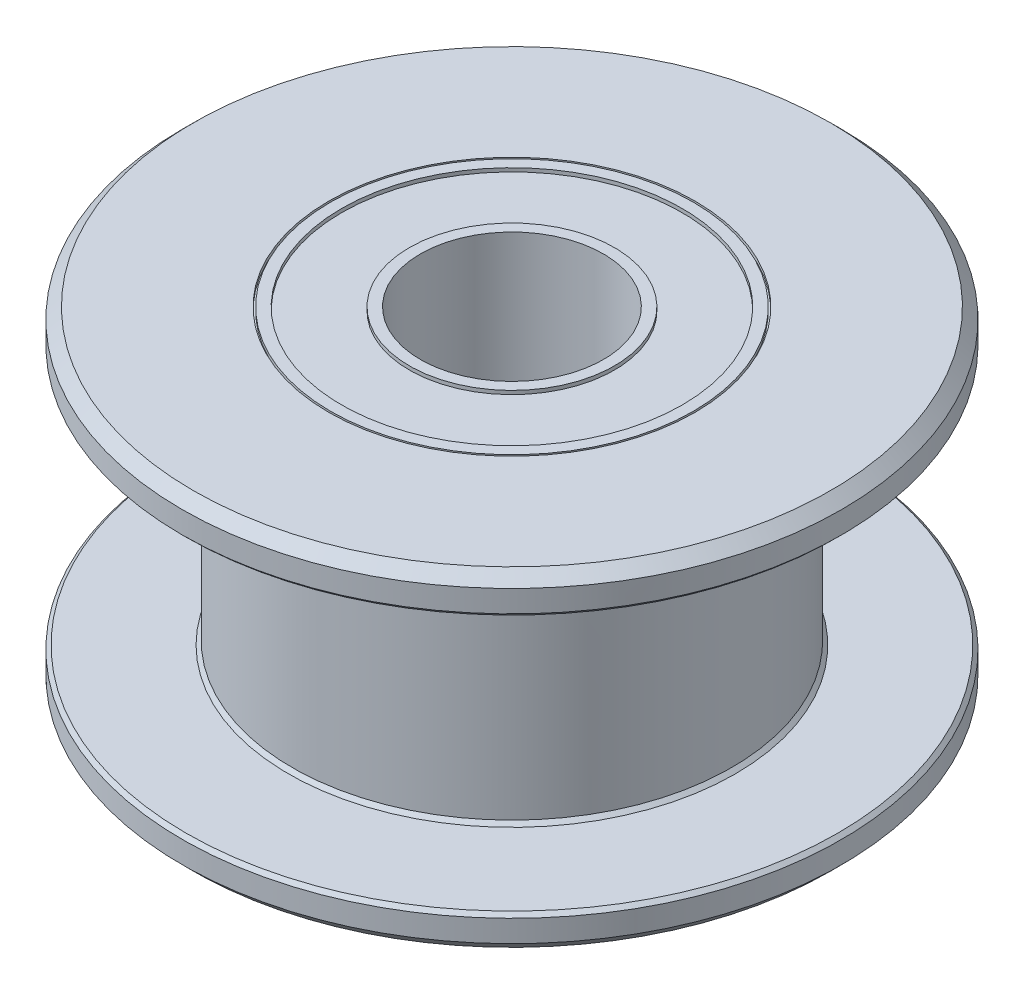
ISO-10303-21;
HEADER;
FILE_DESCRIPTION(('STEP AP214'),'2;1');
FILE_NAME('part.step','',(''),(''),'','','');
FILE_SCHEMA(('AUTOMOTIVE_DESIGN { 1 0 10303 214 1 1 1 1 }'));
ENDSEC;
DATA;
#1=APPLICATION_CONTEXT('core data for automotive mechanical design processes');
#2=APPLICATION_PROTOCOL_DEFINITION('international standard','automotive_design',2000,#1);
#3=PRODUCT_CONTEXT('',#1,'mechanical');
#4=PRODUCT('Part','Part','',(#3));
#5=PRODUCT_RELATED_PRODUCT_CATEGORY('part','',(#4));
#6=PRODUCT_DEFINITION_FORMATION('','',#4);
#7=PRODUCT_DEFINITION_CONTEXT('part definition',#1,'design');
#8=PRODUCT_DEFINITION('design','',#6,#7);
#9=PRODUCT_DEFINITION_SHAPE('','',#8);
#10=(LENGTH_UNIT() NAMED_UNIT(*) SI_UNIT(.MILLI.,.METRE.));
#11=(NAMED_UNIT(*) PLANE_ANGLE_UNIT() SI_UNIT($,.RADIAN.));
#12=(NAMED_UNIT(*) SI_UNIT($,.STERADIAN.) SOLID_ANGLE_UNIT());
#13=UNCERTAINTY_MEASURE_WITH_UNIT(LENGTH_MEASURE(1.E-05),#10,'distance_accuracy_value','');
#14=(GEOMETRIC_REPRESENTATION_CONTEXT(3) GLOBAL_UNCERTAINTY_ASSIGNED_CONTEXT((#13)) GLOBAL_UNIT_ASSIGNED_CONTEXT((#10,
#11,#12)) REPRESENTATION_CONTEXT('',''));
#15=CARTESIAN_POINT('',(0.,0.,0.));
#16=DIRECTION('',(0.,0.,1.));
#17=DIRECTION('',(1.,0.,0.));
#18=AXIS2_PLACEMENT_3D('',#15,#16,#17);
#19=CARTESIAN_POINT('',(-2.5,4.5,0.));
#20=DIRECTION('',(0.,1.,0.));
#21=DIRECTION('',(-1.,0.,0.));
#22=AXIS2_PLACEMENT_3D('',#19,#20,#21);
#23=CYLINDRICAL_SURFACE('',#22,2.8);
#24=CARTESIAN_POINT('',(-2.5,4.5,0.));
#25=DIRECTION('',(0.,1.,0.));
#26=DIRECTION('',(-1.,0.,0.));
#27=AXIS2_PLACEMENT_3D('',#24,#25,#26);
#28=CIRCLE('',#27,2.8);
#29=CARTESIAN_POINT('',(-5.3,4.5,0.));
#30=VERTEX_POINT('',#29);
#31=EDGE_CURVE('E137',#30,#30,#28,.T.);
#32=ORIENTED_EDGE('',*,*,#31,.F.);
#33=EDGE_LOOP('',(#32));
#34=FACE_BOUND('',#33,.T.);
#35=CARTESIAN_POINT('',(-2.5,4.4,0.));
#36=DIRECTION('',(0.,1.,0.));
#37=DIRECTION('',(-1.,0.,0.));
#38=AXIS2_PLACEMENT_3D('',#35,#36,#37);
#39=CIRCLE('',#38,2.8);
#40=CARTESIAN_POINT('',(-5.3,4.4,0.));
#41=VERTEX_POINT('',#40);
#42=EDGE_CURVE('E89',#41,#41,#39,.T.);
#43=ORIENTED_EDGE('',*,*,#42,.T.);
#44=EDGE_LOOP('',(#43));
#45=FACE_BOUND('',#44,.T.);
#46=ADVANCED_FACE('F38',(#34,#45),#23,.T.);
#47=CARTESIAN_POINT('',(2.15,4.4,0.));
#48=DIRECTION('',(0.,-1.,0.));
#49=DIRECTION('',(1.,0.,0.));
#50=AXIS2_PLACEMENT_3D('',#47,#48,#49);
#51=PLANE('',#50);
#52=ORIENTED_EDGE('',*,*,#42,.F.);
#53=EDGE_LOOP('',(#52));
#54=FACE_BOUND('',#53,.T.);
#55=CARTESIAN_POINT('',(-2.5,4.4,0.));
#56=DIRECTION('',(0.,1.,0.));
#57=DIRECTION('',(-1.,0.,0.));
#58=AXIS2_PLACEMENT_3D('',#55,#56,#57);
#59=CIRCLE('',#58,4.65);
#60=CARTESIAN_POINT('',(-7.15,4.4,0.));
#61=VERTEX_POINT('',#60);
#62=EDGE_CURVE('E93',#61,#61,#59,.T.);
#63=ORIENTED_EDGE('',*,*,#62,.T.);
#64=EDGE_LOOP('',(#63));
#65=FACE_BOUND('',#64,.T.);
#66=ADVANCED_FACE('F147',(#54,#65),#51,.F.);
#67=CARTESIAN_POINT('',(-2.5,4.5,0.));
#68=DIRECTION('',(0.,1.,0.));
#69=DIRECTION('',(-1.,0.,0.));
#70=AXIS2_PLACEMENT_3D('',#67,#68,#69);
#71=CYLINDRICAL_SURFACE('',#70,4.65);
#72=ORIENTED_EDGE('',*,*,#62,.F.);
#73=EDGE_LOOP('',(#72));
#74=FACE_BOUND('',#73,.T.);
#75=CARTESIAN_POINT('',(-2.5,4.5,0.));
#76=DIRECTION('',(0.,1.,0.));
#77=DIRECTION('',(-1.,0.,0.));
#78=AXIS2_PLACEMENT_3D('',#75,#76,#77);
#79=CIRCLE('',#78,4.65);
#80=CARTESIAN_POINT('',(-7.15,4.5,0.));
#81=VERTEX_POINT('',#80);
#82=EDGE_CURVE('E97',#81,#81,#79,.T.);
#83=ORIENTED_EDGE('',*,*,#82,.T.);
#84=EDGE_LOOP('',(#83));
#85=FACE_BOUND('',#84,.T.);
#86=ADVANCED_FACE('F153',(#74,#85),#71,.F.);
#87=CARTESIAN_POINT('',(2.45,4.5,0.));
#88=DIRECTION('',(0.,-1.,0.));
#89=DIRECTION('',(1.,0.,0.));
#90=AXIS2_PLACEMENT_3D('',#87,#88,#89);
#91=PLANE('',#90);
#92=ORIENTED_EDGE('',*,*,#82,.F.);
#93=EDGE_LOOP('',(#92));
#94=FACE_BOUND('',#93,.T.);
#95=CARTESIAN_POINT('',(-2.5,4.5,0.));
#96=DIRECTION('',(0.,1.,0.));
#97=DIRECTION('',(-1.,0.,0.));
#98=AXIS2_PLACEMENT_3D('',#95,#96,#97);
#99=CIRCLE('',#98,4.95);
#100=CARTESIAN_POINT('',(-7.45,4.5,0.));
#101=VERTEX_POINT('',#100);
#102=EDGE_CURVE('E101',#101,#101,#99,.T.);
#103=ORIENTED_EDGE('',*,*,#102,.T.);
#104=EDGE_LOOP('',(#103));
#105=FACE_BOUND('',#104,.T.);
#106=ADVANCED_FACE('F159',(#94,#105),#91,.F.);
#107=CARTESIAN_POINT('',(-2.5,4.5,0.));
#108=DIRECTION('',(0.,1.,0.));
#109=DIRECTION('',(-1.,0.,0.));
#110=AXIS2_PLACEMENT_3D('',#107,#108,#109);
#111=CYLINDRICAL_SURFACE('',#110,4.95);
#112=ORIENTED_EDGE('',*,*,#102,.F.);
#113=EDGE_LOOP('',(#112));
#114=FACE_BOUND('',#113,.T.);
#115=CARTESIAN_POINT('',(-2.5,4.4,0.));
#116=DIRECTION('',(0.,1.,0.));
#117=DIRECTION('',(-1.,0.,0.));
#118=AXIS2_PLACEMENT_3D('',#115,#116,#117);
#119=CIRCLE('',#118,4.95);
#120=CARTESIAN_POINT('',(-7.45,4.4,0.));
#121=VERTEX_POINT('',#120);
#122=EDGE_CURVE('E105',#121,#121,#119,.T.);
#123=ORIENTED_EDGE('',*,*,#122,.T.);
#124=EDGE_LOOP('',(#123));
#125=FACE_BOUND('',#124,.T.);
#126=ADVANCED_FACE('F165',(#114,#125),#111,.T.);
#127=CARTESIAN_POINT('',(2.5,4.4,0.));
#128=DIRECTION('',(0.,-1.,0.));
#129=DIRECTION('',(1.,0.,0.));
#130=AXIS2_PLACEMENT_3D('',#127,#128,#129);
#131=PLANE('',#130);
#132=ORIENTED_EDGE('',*,*,#122,.F.);
#133=EDGE_LOOP('',(#132));
#134=FACE_BOUND('',#133,.T.);
#135=CARTESIAN_POINT('',(-2.5,4.4,0.));
#136=DIRECTION('',(0.,1.,0.));
#137=DIRECTION('',(-1.,0.,0.));
#138=AXIS2_PLACEMENT_3D('',#135,#136,#137);
#139=CIRCLE('',#138,5.);
#140=CARTESIAN_POINT('',(-7.5,4.4,0.));
#141=VERTEX_POINT('',#140);
#142=EDGE_CURVE('E109',#141,#141,#139,.T.);
#143=ORIENTED_EDGE('',*,*,#142,.T.);
#144=EDGE_LOOP('',(#143));
#145=FACE_BOUND('',#144,.T.);
#146=ADVANCED_FACE('F171',(#134,#145),#131,.F.);
#147=CARTESIAN_POINT('',(-2.5,4.5,0.));
#148=DIRECTION('',(0.,1.,0.));
#149=DIRECTION('',(-1.,0.,0.));
#150=AXIS2_PLACEMENT_3D('',#147,#148,#149);
#151=CYLINDRICAL_SURFACE('',#150,5.);
#152=ORIENTED_EDGE('',*,*,#142,.F.);
#153=EDGE_LOOP('',(#152));
#154=FACE_BOUND('',#153,.T.);
#155=CARTESIAN_POINT('',(-2.5,4.5,0.));
#156=DIRECTION('',(0.,1.,0.));
#157=DIRECTION('',(-1.,0.,0.));
#158=AXIS2_PLACEMENT_3D('',#155,#156,#157);
#159=CIRCLE('',#158,5.);
#160=CARTESIAN_POINT('',(-7.5,4.5,0.));
#161=VERTEX_POINT('',#160);
#162=EDGE_CURVE('E113',#161,#161,#159,.T.);
#163=ORIENTED_EDGE('',*,*,#162,.T.);
#164=EDGE_LOOP('',(#163));
#165=FACE_BOUND('',#164,.T.);
#166=ADVANCED_FACE('F177',(#154,#165),#151,.F.);
#167=CARTESIAN_POINT('',(6.5,4.5,0.));
#168=DIRECTION('',(0.,-1.,0.));
#169=DIRECTION('',(1.,0.,0.));
#170=AXIS2_PLACEMENT_3D('',#167,#168,#169);
#171=PLANE('',#170);
#172=CARTESIAN_POINT('',(-2.5,4.5,0.));
#173=DIRECTION('',(0.,-1.,0.));
#174=DIRECTION('',(1.,0.,0.));
#175=AXIS2_PLACEMENT_3D('',#172,#173,#174);
#176=CIRCLE('',#175,8.7);
#177=CARTESIAN_POINT('',(-2.5,4.5,-8.7));
#178=VERTEX_POINT('',#177);
#179=EDGE_CURVE('E77',#178,#178,#176,.F.);
#180=ORIENTED_EDGE('',*,*,#179,.T.);
#181=EDGE_LOOP('',(#180));
#182=FACE_BOUND('',#181,.T.);
#183=ORIENTED_EDGE('',*,*,#162,.F.);
#184=EDGE_LOOP('',(#183));
#185=FACE_BOUND('',#184,.T.);
#186=ADVANCED_FACE('F183',(#182,#185),#171,.F.);
#187=CARTESIAN_POINT('',(-2.5,4.5,0.));
#188=DIRECTION('',(0.,1.,0.));
#189=DIRECTION('',(-1.,0.,0.));
#190=AXIS2_PLACEMENT_3D('',#187,#188,#189);
#191=CYLINDRICAL_SURFACE('',#190,9.);
#192=CARTESIAN_POINT('',(-2.5,3.6,0.));
#193=DIRECTION('',(0.,1.,0.));
#194=DIRECTION('',(0.,0.,1.));
#195=AXIS2_PLACEMENT_3D('',#192,#193,#194);
#196=CIRCLE('',#195,9.);
#197=CARTESIAN_POINT('',(-2.5,3.6,9.));
#198=VERTEX_POINT('',#197);
#199=EDGE_CURVE('E46',#198,#198,#196,.T.);
#200=ORIENTED_EDGE('',*,*,#199,.T.);
#201=EDGE_LOOP('',(#200));
#202=FACE_BOUND('',#201,.T.);
#203=CARTESIAN_POINT('',(-2.5,4.19999999999999,0.));
#204=DIRECTION('',(0.,-1.,0.));
#205=DIRECTION('',(0.,0.,-1.));
#206=AXIS2_PLACEMENT_3D('',#203,#204,#205);
#207=CIRCLE('',#206,9.);
#208=CARTESIAN_POINT('',(-2.5,4.19999999999999,-9.));
#209=VERTEX_POINT('',#208);
#210=EDGE_CURVE('E73',#209,#209,#207,.T.);
#211=ORIENTED_EDGE('',*,*,#210,.T.);
#212=EDGE_LOOP('',(#211));
#213=FACE_BOUND('',#212,.T.);
#214=ADVANCED_FACE('F188',(#202,#213),#191,.T.);
#215=CARTESIAN_POINT('',(6.5,3.5,0.));
#216=DIRECTION('',(0.,1.,0.));
#217=DIRECTION('',(-1.,0.,0.));
#218=AXIS2_PLACEMENT_3D('',#215,#216,#217);
#219=PLANE('',#218);
#220=CARTESIAN_POINT('',(-2.5,3.5,0.));
#221=DIRECTION('',(0.,1.,0.));
#222=DIRECTION('',(-1.,0.,0.));
#223=AXIS2_PLACEMENT_3D('',#220,#221,#222);
#224=CIRCLE('',#223,8.9);
#225=CARTESIAN_POINT('',(-11.4,3.49999999999999,0.));
#226=VERTEX_POINT('',#225);
#227=EDGE_CURVE('E10',#226,#226,#224,.F.);
#228=ORIENTED_EDGE('',*,*,#227,.T.);
#229=EDGE_LOOP('',(#228));
#230=FACE_BOUND('',#229,.T.);
#231=CARTESIAN_POINT('',(-2.5,3.5,0.));
#232=DIRECTION('',(0.,1.,0.));
#233=DIRECTION('',(-1.,0.,0.));
#234=AXIS2_PLACEMENT_3D('',#231,#232,#233);
#235=CIRCLE('',#234,6.);
#236=CARTESIAN_POINT('',(-8.5,3.5,0.));
#237=VERTEX_POINT('',#236);
#238=EDGE_CURVE('E117',#237,#237,#235,.T.);
#239=ORIENTED_EDGE('',*,*,#238,.T.);
#240=EDGE_LOOP('',(#239));
#241=FACE_BOUND('',#240,.T.);
#242=ADVANCED_FACE('F194',(#230,#241),#219,.F.);
#243=CARTESIAN_POINT('',(-2.5,4.5,0.));
#244=DIRECTION('',(0.,1.,0.));
#245=DIRECTION('',(-1.,0.,0.));
#246=AXIS2_PLACEMENT_3D('',#243,#244,#245);
#247=CYLINDRICAL_SURFACE('',#246,6.);
#248=CARTESIAN_POINT('',(-2.5,-3.4,0.));
#249=DIRECTION('',(0.,-1.,0.));
#250=DIRECTION('',(0.,0.,-1.));
#251=AXIS2_PLACEMENT_3D('',#248,#249,#250);
#252=CIRCLE('',#251,6.);
#253=CARTESIAN_POINT('',(-2.5,-3.4,-6.));
#254=VERTEX_POINT('',#253);
#255=EDGE_CURVE('E51',#254,#254,#252,.F.);
#256=ORIENTED_EDGE('',*,*,#255,.T.);
#257=EDGE_LOOP('',(#256));
#258=FACE_BOUND('',#257,.T.);
#259=ORIENTED_EDGE('',*,*,#238,.F.);
#260=EDGE_LOOP('',(#259));
#261=FACE_BOUND('',#260,.T.);
#262=ADVANCED_FACE('F231',(#258,#261),#247,.T.);
#263=CARTESIAN_POINT('',(3.5,-3.5,0.));
#264=DIRECTION('',(0.,-1.,0.));
#265=DIRECTION('',(1.,0.,0.));
#266=AXIS2_PLACEMENT_3D('',#263,#264,#265);
#267=PLANE('',#266);
#268=CARTESIAN_POINT('',(-2.5,-3.5,0.));
#269=DIRECTION('',(0.,-1.,0.));
#270=DIRECTION('',(1.,0.,0.));
#271=AXIS2_PLACEMENT_3D('',#268,#269,#270);
#272=CIRCLE('',#271,8.9);
#273=CARTESIAN_POINT('',(6.4,-3.5,0.));
#274=VERTEX_POINT('',#273);
#275=EDGE_CURVE('E65',#274,#274,#272,.F.);
#276=ORIENTED_EDGE('',*,*,#275,.T.);
#277=EDGE_LOOP('',(#276));
#278=FACE_BOUND('',#277,.T.);
#279=CARTESIAN_POINT('',(-2.5,-3.5,0.));
#280=DIRECTION('',(0.,-1.,0.));
#281=DIRECTION('',(1.,0.,0.));
#282=AXIS2_PLACEMENT_3D('',#279,#280,#281);
#283=CIRCLE('',#282,6.1);
#284=CARTESIAN_POINT('',(3.6,-3.5,0.));
#285=VERTEX_POINT('',#284);
#286=EDGE_CURVE('E69',#285,#285,#283,.T.);
#287=ORIENTED_EDGE('',*,*,#286,.T.);
#288=EDGE_LOOP('',(#287));
#289=FACE_BOUND('',#288,.T.);
#290=ADVANCED_FACE('F234',(#278,#289),#267,.F.);
#291=CARTESIAN_POINT('',(-2.5,4.5,0.));
#292=DIRECTION('',(0.,1.,0.));
#293=DIRECTION('',(-1.,0.,0.));
#294=AXIS2_PLACEMENT_3D('',#291,#292,#293);
#295=CYLINDRICAL_SURFACE('',#294,9.);
#296=CARTESIAN_POINT('',(-2.5,-3.59999999999999,0.));
#297=DIRECTION('',(0.,-1.,0.));
#298=DIRECTION('',(0.,0.,-1.));
#299=AXIS2_PLACEMENT_3D('',#296,#297,#298);
#300=CIRCLE('',#299,9.);
#301=CARTESIAN_POINT('',(-11.5,-3.6,0.));
#302=VERTEX_POINT('',#301);
#303=EDGE_CURVE('E59',#302,#302,#300,.T.);
#304=CARTESIAN_POINT('',(-2.5,-4.2,0.));
#305=DIRECTION('',(0.,1.,0.));
#306=DIRECTION('',(0.,0.,1.));
#307=AXIS2_PLACEMENT_3D('',#304,#305,#306);
#308=CIRCLE('',#307,9.);
#309=CARTESIAN_POINT('',(-11.5,-4.2,0.));
#310=VERTEX_POINT('',#309);
#311=EDGE_CURVE('E85',#310,#310,#308,.T.);
#312=CARTESIAN_POINT('',(-11.5,-3.6,0.));
#313=CARTESIAN_POINT('',(-11.5,-3.60625,0.));
#314=CARTESIAN_POINT('',(-11.5,-3.6125,0.));
#315=CARTESIAN_POINT('',(-11.5,-3.625,0.));
#316=CARTESIAN_POINT('',(-11.5,-3.63125,0.));
#317=CARTESIAN_POINT('',(-11.5,-3.64375,0.));
#318=CARTESIAN_POINT('',(-11.5,-3.65,0.));
#319=CARTESIAN_POINT('',(-11.5,-3.6625,0.));
#320=CARTESIAN_POINT('',(-11.5,-3.66875,0.));
#321=CARTESIAN_POINT('',(-11.5,-3.68125,0.));
#322=CARTESIAN_POINT('',(-11.5,-3.6875,0.));
#323=CARTESIAN_POINT('',(-11.5,-3.7,0.));
#324=CARTESIAN_POINT('',(-11.5,-3.70625,0.));
#325=CARTESIAN_POINT('',(-11.5,-3.71875,0.));
#326=CARTESIAN_POINT('',(-11.5,-3.725,0.));
#327=CARTESIAN_POINT('',(-11.5,-3.7375,0.));
#328=CARTESIAN_POINT('',(-11.5,-3.74375,0.));
#329=CARTESIAN_POINT('',(-11.5,-3.75625,0.));
#330=CARTESIAN_POINT('',(-11.5,-3.7625,0.));
#331=CARTESIAN_POINT('',(-11.5,-3.775,0.));
#332=CARTESIAN_POINT('',(-11.5,-3.78125,0.));
#333=CARTESIAN_POINT('',(-11.5,-3.79375,0.));
#334=CARTESIAN_POINT('',(-11.5,-3.8,0.));
#335=CARTESIAN_POINT('',(-11.5,-3.8125,0.));
#336=CARTESIAN_POINT('',(-11.5,-3.81875,0.));
#337=CARTESIAN_POINT('',(-11.5,-3.83124999999999,0.));
#338=CARTESIAN_POINT('',(-11.5,-3.8375,0.));
#339=CARTESIAN_POINT('',(-11.5,-3.85,0.));
#340=CARTESIAN_POINT('',(-11.5,-3.85625,0.));
#341=CARTESIAN_POINT('',(-11.5,-3.86875,0.));
#342=CARTESIAN_POINT('',(-11.5,-3.875,0.));
#343=CARTESIAN_POINT('',(-11.5,-3.8875,0.));
#344=CARTESIAN_POINT('',(-11.5,-3.89375,0.));
#345=CARTESIAN_POINT('',(-11.5,-3.90625,0.));
#346=CARTESIAN_POINT('',(-11.5,-3.91249999999999,0.));
#347=CARTESIAN_POINT('',(-11.5,-3.925,0.));
#348=CARTESIAN_POINT('',(-11.5,-3.93124999999999,0.));
#349=CARTESIAN_POINT('',(-11.5,-3.94375,0.));
#350=CARTESIAN_POINT('',(-11.5,-3.95,0.));
#351=CARTESIAN_POINT('',(-11.5,-3.9625,0.));
#352=CARTESIAN_POINT('',(-11.5,-3.96875,0.));
#353=CARTESIAN_POINT('',(-11.5,-3.98125,0.));
#354=CARTESIAN_POINT('',(-11.5,-3.9875,0.));
#355=CARTESIAN_POINT('',(-11.5,-4.,0.));
#356=CARTESIAN_POINT('',(-11.5,-4.00625,0.));
#357=CARTESIAN_POINT('',(-11.5,-4.01875,0.));
#358=CARTESIAN_POINT('',(-11.5,-4.025,0.));
#359=CARTESIAN_POINT('',(-11.5,-4.0375,0.));
#360=CARTESIAN_POINT('',(-11.5,-4.04374999999999,0.));
#361=CARTESIAN_POINT('',(-11.5,-4.05625,0.));
#362=CARTESIAN_POINT('',(-11.5,-4.0625,0.));
#363=CARTESIAN_POINT('',(-11.5,-4.075,0.));
#364=CARTESIAN_POINT('',(-11.5,-4.08125,0.));
#365=CARTESIAN_POINT('',(-11.5,-4.09375,0.));
#366=CARTESIAN_POINT('',(-11.5,-4.1,0.));
#367=CARTESIAN_POINT('',(-11.5,-4.1125,0.));
#368=CARTESIAN_POINT('',(-11.5,-4.11875,0.));
#369=CARTESIAN_POINT('',(-11.5,-4.13125,0.));
#370=CARTESIAN_POINT('',(-11.5,-4.13749999999999,0.));
#371=CARTESIAN_POINT('',(-11.5,-4.15,0.));
#372=CARTESIAN_POINT('',(-11.5,-4.15625,0.));
#373=CARTESIAN_POINT('',(-11.5,-4.16875,0.));
#374=CARTESIAN_POINT('',(-11.5,-4.175,0.));
#375=CARTESIAN_POINT('',(-11.5,-4.1875,0.));
#376=CARTESIAN_POINT('',(-11.5,-4.19375,0.));
#377=CARTESIAN_POINT('',(-11.5,-4.2,0.));
#378=B_SPLINE_CURVE_WITH_KNOTS('',3,(#312,#313,#314,#315,#316,#317,#318,#319,#320,#321,#322,
#323,#324,#325,#326,#327,#328,#329,#330,#331,#332,#333,#334,#335,#336,#337,#338,#339,#340,#341,
#342,#343,#344,#345,#346,#347,#348,#349,#350,#351,#352,#353,#354,#355,#356,#357,#358,#359,#360,
#361,#362,#363,#364,#365,#366,#367,#368,#369,#370,#371,#372,#373,#374,#375,#376,#377),
.UNSPECIFIED.,.F.,.F.,(4,2,2,2,2,2,2,2,2,2,2,2,2,2,2,2,2,2,2,2,2,2,2,2,2,2,2,2,2,2,2,2,4),(0.,
0.0187499999999997,0.0374999999999993,0.0562500000000007,0.0750000000000004,0.0937500000000001,
0.1125,0.131249999999999,0.150000000000001,0.168750000000001,0.1875,0.20625,0.225,
0.243749999999999,0.262500000000001,0.28125,0.3,0.31875,0.337499999999999,0.356250000000001,
0.375,0.39375,0.4125,0.431249999999999,0.449999999999999,0.46875,0.4875,0.50625,
0.524999999999999,0.543749999999999,0.5625,0.58125,0.6),.UNSPECIFIED.);
#379=EDGE_CURVE('BSEAM244',#302,#310,#378,.T.);
#380=ORIENTED_EDGE('',*,*,#303,.T.);
#381=ORIENTED_EDGE('',*,*,#311,.T.);
#382=ORIENTED_EDGE('',*,*,#379,.T.);
#383=ORIENTED_EDGE('',*,*,#379,.F.);
#384=EDGE_LOOP('',(#380,#382,#381,#383));
#385=FACE_BOUND('',#384,.T.);
#386=ADVANCED_FACE('F244',(#385),#295,.T.);
#387=CARTESIAN_POINT('',(6.5,-4.5,0.));
#388=DIRECTION('',(0.,1.,0.));
#389=DIRECTION('',(-1.,0.,0.));
#390=AXIS2_PLACEMENT_3D('',#387,#388,#389);
#391=PLANE('',#390);
#392=CARTESIAN_POINT('',(-2.5,-4.5,0.));
#393=DIRECTION('',(0.,1.,0.));
#394=DIRECTION('',(-1.,0.,0.));
#395=AXIS2_PLACEMENT_3D('',#392,#393,#394);
#396=CIRCLE('',#395,8.69999999999999);
#397=CARTESIAN_POINT('',(-11.2,-4.5,0.));
#398=VERTEX_POINT('',#397);
#399=EDGE_CURVE('E81',#398,#398,#396,.F.);
#400=ORIENTED_EDGE('',*,*,#399,.T.);
#401=EDGE_LOOP('',(#400));
#402=FACE_BOUND('',#401,.T.);
#403=CARTESIAN_POINT('',(-2.5,-4.5,0.));
#404=DIRECTION('',(0.,1.,0.));
#405=DIRECTION('',(-1.,0.,0.));
#406=AXIS2_PLACEMENT_3D('',#403,#404,#405);
#407=CIRCLE('',#406,4.2);
#408=CARTESIAN_POINT('',(-6.7,-4.5,0.));
#409=VERTEX_POINT('',#408);
#410=EDGE_CURVE('E121',#409,#409,#407,.T.);
#411=ORIENTED_EDGE('',*,*,#410,.T.);
#412=EDGE_LOOP('',(#411));
#413=FACE_BOUND('',#412,.T.);
#414=ADVANCED_FACE('F248',(#402,#413),#391,.F.);
#415=CARTESIAN_POINT('',(-2.5,4.5,0.));
#416=DIRECTION('',(0.,1.,0.));
#417=DIRECTION('',(-1.,0.,0.));
#418=AXIS2_PLACEMENT_3D('',#415,#416,#417);
#419=CYLINDRICAL_SURFACE('',#418,4.2);
#420=ORIENTED_EDGE('',*,*,#410,.F.);
#421=EDGE_LOOP('',(#420));
#422=FACE_BOUND('',#421,.T.);
#423=CARTESIAN_POINT('',(-2.5,-4.4,0.));
#424=DIRECTION('',(0.,1.,0.));
#425=DIRECTION('',(-1.,0.,0.));
#426=AXIS2_PLACEMENT_3D('',#423,#424,#425);
#427=CIRCLE('',#426,4.2);
#428=CARTESIAN_POINT('',(-6.7,-4.4,0.));
#429=VERTEX_POINT('',#428);
#430=EDGE_CURVE('E125',#429,#429,#427,.T.);
#431=ORIENTED_EDGE('',*,*,#430,.T.);
#432=EDGE_LOOP('',(#431));
#433=FACE_BOUND('',#432,.T.);
#434=ADVANCED_FACE('F252',(#422,#433),#419,.F.);
#435=CARTESIAN_POINT('',(0.,-4.4,0.));
#436=DIRECTION('',(0.,1.,0.));
#437=DIRECTION('',(-1.,0.,0.));
#438=AXIS2_PLACEMENT_3D('',#435,#436,#437);
#439=PLANE('',#438);
#440=ORIENTED_EDGE('',*,*,#430,.F.);
#441=EDGE_LOOP('',(#440));
#442=FACE_BOUND('',#441,.T.);
#443=CARTESIAN_POINT('',(-2.5,-4.4,0.));
#444=DIRECTION('',(0.,1.,0.));
#445=DIRECTION('',(-1.,0.,0.));
#446=AXIS2_PLACEMENT_3D('',#443,#444,#445);
#447=CIRCLE('',#446,2.5);
#448=CARTESIAN_POINT('',(-5.,-4.4,0.));
#449=VERTEX_POINT('',#448);
#450=EDGE_CURVE('E129',#449,#449,#447,.T.);
#451=ORIENTED_EDGE('',*,*,#450,.T.);
#452=EDGE_LOOP('',(#451));
#453=FACE_BOUND('',#452,.T.);
#454=ADVANCED_FACE('F256',(#442,#453),#439,.F.);
#455=CARTESIAN_POINT('',(-2.5,4.5,0.));
#456=DIRECTION('',(0.,1.,0.));
#457=DIRECTION('',(-1.,0.,0.));
#458=AXIS2_PLACEMENT_3D('',#455,#456,#457);
#459=CYLINDRICAL_SURFACE('',#458,2.5);
#460=ORIENTED_EDGE('',*,*,#450,.F.);
#461=EDGE_LOOP('',(#460));
#462=FACE_BOUND('',#461,.T.);
#463=CARTESIAN_POINT('',(-2.5,4.5,0.));
#464=DIRECTION('',(0.,1.,0.));
#465=DIRECTION('',(-1.,0.,0.));
#466=AXIS2_PLACEMENT_3D('',#463,#464,#465);
#467=CIRCLE('',#466,2.5);
#468=CARTESIAN_POINT('',(-5.,4.5,0.));
#469=VERTEX_POINT('',#468);
#470=EDGE_CURVE('E133',#469,#469,#467,.T.);
#471=ORIENTED_EDGE('',*,*,#470,.T.);
#472=EDGE_LOOP('',(#471));
#473=FACE_BOUND('',#472,.T.);
#474=ADVANCED_FACE('F260',(#462,#473),#459,.F.);
#475=CARTESIAN_POINT('',(0.,4.5,0.));
#476=DIRECTION('',(0.,-1.,0.));
#477=DIRECTION('',(1.,0.,0.));
#478=AXIS2_PLACEMENT_3D('',#475,#476,#477);
#479=PLANE('',#478);
#480=ORIENTED_EDGE('',*,*,#470,.F.);
#481=EDGE_LOOP('',(#480));
#482=FACE_BOUND('',#481,.T.);
#483=ORIENTED_EDGE('',*,*,#31,.T.);
#484=EDGE_LOOP('',(#483));
#485=FACE_BOUND('',#484,.T.);
#486=ADVANCED_FACE('F143',(#482,#485),#479,.F.);
#487=CARTESIAN_POINT('',(-2.5,-4.2,0.));
#488=DIRECTION('',(0.,1.,0.));
#489=DIRECTION('',(0.,0.,1.));
#490=AXIS2_PLACEMENT_3D('',#487,#488,#489);
#491=CONICAL_SURFACE('',#490,9.,0.785398163397448);
#492=ORIENTED_EDGE('',*,*,#399,.F.);
#493=EDGE_LOOP('',(#492));
#494=FACE_BOUND('',#493,.T.);
#495=ORIENTED_EDGE('',*,*,#311,.F.);
#496=EDGE_LOOP('',(#495));
#497=FACE_BOUND('',#496,.T.);
#498=ADVANCED_FACE('F199',(#494,#497),#491,.T.);
#499=CARTESIAN_POINT('',(-2.5,4.5,0.));
#500=DIRECTION('',(0.,-1.,0.));
#501=DIRECTION('',(0.,0.,-1.));
#502=AXIS2_PLACEMENT_3D('',#499,#500,#501);
#503=CONICAL_SURFACE('',#502,8.7,0.785398163397443);
#504=CARTESIAN_POINT('',(-2.5,4.19999999999999,-9.));
#505=CARTESIAN_POINT('',(-2.5,4.20312499999999,-8.996875));
#506=CARTESIAN_POINT('',(-2.5,4.20624999999999,-8.99375));
#507=CARTESIAN_POINT('',(-2.5,4.21249999999999,-8.9875));
#508=CARTESIAN_POINT('',(-2.5,4.21562499999999,-8.984375));
#509=CARTESIAN_POINT('',(-2.5,4.22187499999999,-8.978125));
#510=CARTESIAN_POINT('',(-2.5,4.22499999999999,-8.975));
#511=CARTESIAN_POINT('',(-2.5,4.23124999999999,-8.96875));
#512=CARTESIAN_POINT('',(-2.5,4.23437499999999,-8.965625));
#513=CARTESIAN_POINT('',(-2.5,4.24062499999999,-8.959375));
#514=CARTESIAN_POINT('',(-2.5,4.24375,-8.95625));
#515=CARTESIAN_POINT('',(-2.5,4.24999999999999,-8.95));
#516=CARTESIAN_POINT('',(-2.5,4.253125,-8.946875));
#517=CARTESIAN_POINT('',(-2.5,4.259375,-8.940625));
#518=CARTESIAN_POINT('',(-2.5,4.26249999999999,-8.9375));
#519=CARTESIAN_POINT('',(-2.5,4.26874999999999,-8.93125));
#520=CARTESIAN_POINT('',(-2.5,4.271875,-8.928125));
#521=CARTESIAN_POINT('',(-2.5,4.278125,-8.921875));
#522=CARTESIAN_POINT('',(-2.5,4.28125,-8.91875));
#523=CARTESIAN_POINT('',(-2.5,4.2875,-8.9125));
#524=CARTESIAN_POINT('',(-2.5,4.290625,-8.909375));
#525=CARTESIAN_POINT('',(-2.5,4.296875,-8.903125));
#526=CARTESIAN_POINT('',(-2.5,4.3,-8.9));
#527=CARTESIAN_POINT('',(-2.5,4.30625,-8.89375));
#528=CARTESIAN_POINT('',(-2.5,4.309375,-8.890625));
#529=CARTESIAN_POINT('',(-2.5,4.315625,-8.884375));
#530=CARTESIAN_POINT('',(-2.5,4.31875,-8.88125));
#531=CARTESIAN_POINT('',(-2.5,4.325,-8.875));
#532=CARTESIAN_POINT('',(-2.5,4.328125,-8.871875));
#533=CARTESIAN_POINT('',(-2.5,4.334375,-8.865625));
#534=CARTESIAN_POINT('',(-2.5,4.3375,-8.8625));
#535=CARTESIAN_POINT('',(-2.5,4.34375,-8.85625));
#536=CARTESIAN_POINT('',(-2.5,4.346875,-8.853125));
#537=CARTESIAN_POINT('',(-2.5,4.353125,-8.846875));
#538=CARTESIAN_POINT('',(-2.5,4.35625,-8.84375));
#539=CARTESIAN_POINT('',(-2.5,4.3625,-8.8375));
#540=CARTESIAN_POINT('',(-2.5,4.365625,-8.834375));
#541=CARTESIAN_POINT('',(-2.5,4.371875,-8.828125));
#542=CARTESIAN_POINT('',(-2.5,4.375,-8.825));
#543=CARTESIAN_POINT('',(-2.5,4.38125,-8.81875));
#544=CARTESIAN_POINT('',(-2.5,4.384375,-8.815625));
#545=CARTESIAN_POINT('',(-2.5,4.390625,-8.809375));
#546=CARTESIAN_POINT('',(-2.5,4.39375,-8.80625));
#547=CARTESIAN_POINT('',(-2.5,4.4,-8.8));
#548=CARTESIAN_POINT('',(-2.5,4.403125,-8.796875));
#549=CARTESIAN_POINT('',(-2.5,4.409375,-8.790625));
#550=CARTESIAN_POINT('',(-2.5,4.4125,-8.7875));
#551=CARTESIAN_POINT('',(-2.5,4.41875,-8.78125));
#552=CARTESIAN_POINT('',(-2.5,4.421875,-8.778125));
#553=CARTESIAN_POINT('',(-2.5,4.428125,-8.771875));
#554=CARTESIAN_POINT('',(-2.5,4.43125,-8.76875));
#555=CARTESIAN_POINT('',(-2.5,4.4375,-8.7625));
#556=CARTESIAN_POINT('',(-2.5,4.440625,-8.759375));
#557=CARTESIAN_POINT('',(-2.5,4.446875,-8.753125));
#558=CARTESIAN_POINT('',(-2.5,4.45,-8.75));
#559=CARTESIAN_POINT('',(-2.5,4.45625,-8.74375));
#560=CARTESIAN_POINT('',(-2.5,4.459375,-8.740625));
#561=CARTESIAN_POINT('',(-2.5,4.465625,-8.734375));
#562=CARTESIAN_POINT('',(-2.5,4.46875,-8.73125));
#563=CARTESIAN_POINT('',(-2.5,4.475,-8.725));
#564=CARTESIAN_POINT('',(-2.5,4.478125,-8.721875));
#565=CARTESIAN_POINT('',(-2.5,4.484375,-8.715625));
#566=CARTESIAN_POINT('',(-2.5,4.4875,-8.7125));
#567=CARTESIAN_POINT('',(-2.5,4.49375,-8.70625));
#568=CARTESIAN_POINT('',(-2.5,4.496875,-8.703125));
#569=CARTESIAN_POINT('',(-2.5,4.5,-8.7));
#570=B_SPLINE_CURVE_WITH_KNOTS('',3,(#504,#505,#506,#507,#508,#509,#510,#511,#512,#513,#514,
#515,#516,#517,#518,#519,#520,#521,#522,#523,#524,#525,#526,#527,#528,#529,#530,#531,#532,#533,
#534,#535,#536,#537,#538,#539,#540,#541,#542,#543,#544,#545,#546,#547,#548,#549,#550,#551,#552,
#553,#554,#555,#556,#557,#558,#559,#560,#561,#562,#563,#564,#565,#566,#567,#568,#569),
.UNSPECIFIED.,.F.,.F.,(4,2,2,2,2,2,2,2,2,2,2,2,2,2,2,2,2,2,2,2,2,2,2,2,2,2,2,2,2,2,2,2,4),(0.,
0.0132582521472481,0.0265165042944951,0.0397747564417438,0.053033008588992,0.0662912607362389,
0.0795495128834876,0.0928077650307358,0.106066017177983,0.119324269325231,0.13258252147248,
0.145840773619727,0.159099025766975,0.172357277914222,0.185615530061471,0.198873782208719,
0.212132034355967,0.225390286503215,0.238648538650462,0.251906790797711,0.265165042944959,
0.278423295092206,0.291681547239454,0.304939799386703,0.31819805153395,0.331456303681198,
0.344714555828446,0.357972807975694,0.371231060122942,0.384489312270189,0.397747564417438,
0.411005816564686,0.424264068711933),.UNSPECIFIED.);
#571=EDGE_CURVE('BSEAM205',#209,#178,#570,.T.);
#572=ORIENTED_EDGE('',*,*,#210,.F.);
#573=ORIENTED_EDGE('',*,*,#179,.F.);
#574=ORIENTED_EDGE('',*,*,#571,.T.);
#575=ORIENTED_EDGE('',*,*,#571,.F.);
#576=EDGE_LOOP('',(#572,#574,#573,#575));
#577=FACE_BOUND('',#576,.T.);
#578=ADVANCED_FACE('F205',(#577),#503,.T.);
#579=CARTESIAN_POINT('',(-2.5,-3.5,0.));
#580=DIRECTION('',(0.,-1.,0.));
#581=DIRECTION('',(0.,0.,-1.));
#582=AXIS2_PLACEMENT_3D('',#579,#580,#581);
#583=CONICAL_SURFACE('',#582,8.9,0.785398163397466);
#584=ORIENTED_EDGE('',*,*,#303,.F.);
#585=EDGE_LOOP('',(#584));
#586=FACE_BOUND('',#585,.T.);
#587=ORIENTED_EDGE('',*,*,#275,.F.);
#588=EDGE_LOOP('',(#587));
#589=FACE_BOUND('',#588,.T.);
#590=ADVANCED_FACE('F212',(#586,#589),#583,.T.);
#591=CARTESIAN_POINT('',(-2.5,-3.4,0.));
#592=DIRECTION('',(0.,-1.,0.));
#593=DIRECTION('',(0.,0.,-1.));
#594=AXIS2_PLACEMENT_3D('',#591,#592,#593);
#595=CONICAL_SURFACE('',#594,6.,0.78539816339744);
#596=ORIENTED_EDGE('',*,*,#286,.F.);
#597=EDGE_LOOP('',(#596));
#598=FACE_BOUND('',#597,.T.);
#599=ORIENTED_EDGE('',*,*,#255,.F.);
#600=EDGE_LOOP('',(#599));
#601=FACE_BOUND('',#600,.T.);
#602=ADVANCED_FACE('F218',(#598,#601),#595,.T.);
#603=CARTESIAN_POINT('',(-2.5,3.59999999999999,0.));
#604=DIRECTION('',(0.,1.,0.));
#605=DIRECTION('',(0.,0.,1.));
#606=AXIS2_PLACEMENT_3D('',#603,#604,#605);
#607=CONICAL_SURFACE('',#606,9.,0.785398163397448);
#608=ORIENTED_EDGE('',*,*,#227,.F.);
#609=EDGE_LOOP('',(#608));
#610=FACE_BOUND('',#609,.T.);
#611=ORIENTED_EDGE('',*,*,#199,.F.);
#612=EDGE_LOOP('',(#611));
#613=FACE_BOUND('',#612,.T.);
#614=ADVANCED_FACE('F41',(#610,#613),#607,.T.);
#615=CLOSED_SHELL('',(#46,#66,#86,#106,#126,#146,#166,#186,#214,#242,#262,#290,#386,#414,#434,
#454,#474,#486,#498,#578,#590,#602,#614));
#616=MANIFOLD_SOLID_BREP('B2',#615);
#617=ADVANCED_BREP_SHAPE_REPRESENTATION('',(#18,#616),#14);
#618=SHAPE_DEFINITION_REPRESENTATION(#9,#617);
ENDSEC;
END-ISO-10303-21;
